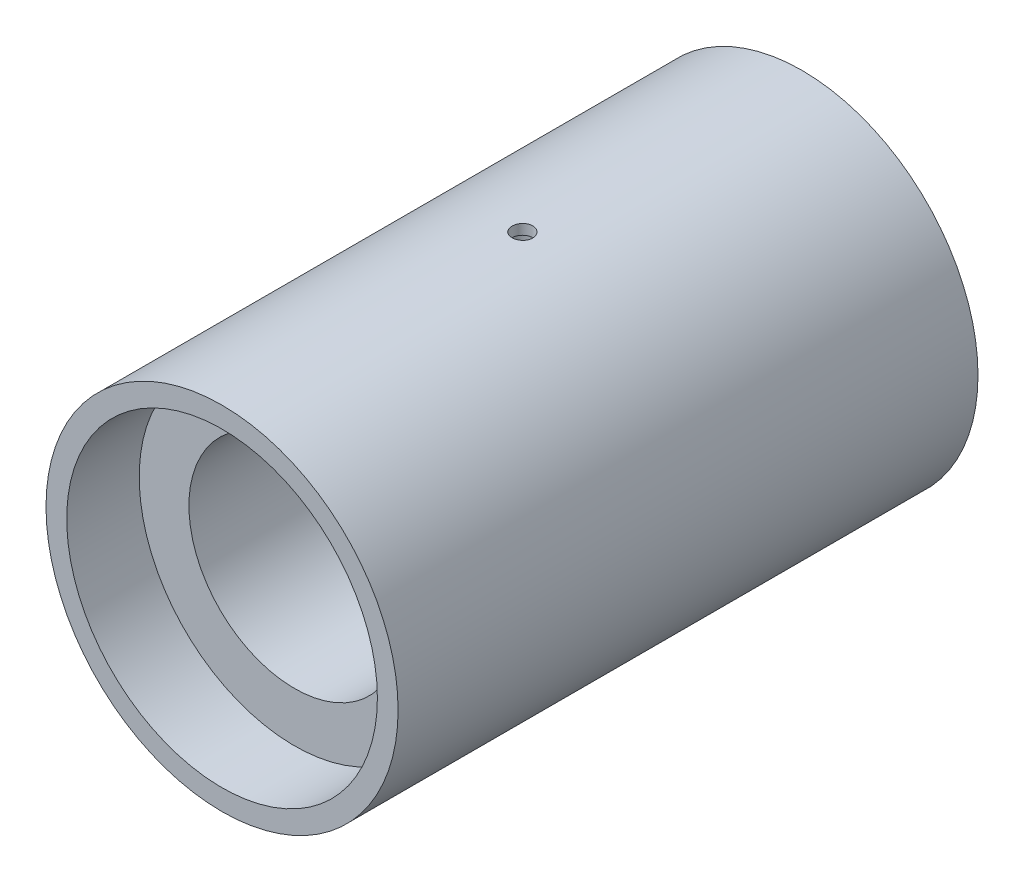
ISO-10303-21;
HEADER;
FILE_DESCRIPTION(('STEP AP214'),'2;1');
FILE_NAME('part.step','',(''),(''),'','','');
FILE_SCHEMA(('AUTOMOTIVE_DESIGN { 1 0 10303 214 1 1 1 1 }'));
ENDSEC;
DATA;
#1=APPLICATION_CONTEXT('core data for automotive mechanical design processes');
#2=APPLICATION_PROTOCOL_DEFINITION('international standard','automotive_design',2000,#1);
#3=PRODUCT_CONTEXT('',#1,'mechanical');
#4=PRODUCT('Part','Part','',(#3));
#5=PRODUCT_RELATED_PRODUCT_CATEGORY('part','',(#4));
#6=PRODUCT_DEFINITION_FORMATION('','',#4);
#7=PRODUCT_DEFINITION_CONTEXT('part definition',#1,'design');
#8=PRODUCT_DEFINITION('design','',#6,#7);
#9=PRODUCT_DEFINITION_SHAPE('','',#8);
#10=(LENGTH_UNIT() NAMED_UNIT(*) SI_UNIT(.MILLI.,.METRE.));
#11=(NAMED_UNIT(*) PLANE_ANGLE_UNIT() SI_UNIT($,.RADIAN.));
#12=(NAMED_UNIT(*) SI_UNIT($,.STERADIAN.) SOLID_ANGLE_UNIT());
#13=UNCERTAINTY_MEASURE_WITH_UNIT(LENGTH_MEASURE(1.E-05),#10,'distance_accuracy_value','');
#14=(GEOMETRIC_REPRESENTATION_CONTEXT(3) GLOBAL_UNCERTAINTY_ASSIGNED_CONTEXT((#13)) GLOBAL_UNIT_ASSIGNED_CONTEXT((#10,
#11,#12)) REPRESENTATION_CONTEXT('',''));
#15=CARTESIAN_POINT('',(0.,0.,0.));
#16=DIRECTION('',(0.,0.,1.));
#17=DIRECTION('',(1.,0.,0.));
#18=AXIS2_PLACEMENT_3D('',#15,#16,#17);
#19=CARTESIAN_POINT('',(10.2,0.,-7.));
#20=DIRECTION('',(0.,0.,-1.));
#21=DIRECTION('',(-1.,0.,0.));
#22=AXIS2_PLACEMENT_3D('',#19,#20,#21);
#23=PLANE('',#22);
#24=CARTESIAN_POINT('',(0.,0.,-7.));
#25=DIRECTION('',(0.,0.,1.));
#26=DIRECTION('',(1.,0.,0.));
#27=AXIS2_PLACEMENT_3D('',#24,#25,#26);
#28=CIRCLE('',#27,15.);
#29=CARTESIAN_POINT('',(15.,0.,-7.));
#30=VERTEX_POINT('',#29);
#31=EDGE_CURVE('E238',#30,#30,#28,.T.);
#32=ORIENTED_EDGE('',*,*,#31,.T.);
#33=EDGE_LOOP('',(#32));
#34=FACE_BOUND('',#33,.T.);
#35=CARTESIAN_POINT('',(0.,0.,-7.));
#36=DIRECTION('',(0.,0.,1.));
#37=DIRECTION('',(1.,0.,0.));
#38=AXIS2_PLACEMENT_3D('',#35,#36,#37);
#39=CIRCLE('',#38,10.2);
#40=CARTESIAN_POINT('',(10.2,0.,-7.));
#41=VERTEX_POINT('',#40);
#42=EDGE_CURVE('E11',#41,#41,#39,.F.);
#43=ORIENTED_EDGE('',*,*,#42,.T.);
#44=EDGE_LOOP('',(#43));
#45=FACE_BOUND('',#44,.T.);
#46=ADVANCED_FACE('F41',(#34,#45),#23,.F.);
#47=CARTESIAN_POINT('',(0.,0.,-55.));
#48=DIRECTION('',(0.,0.,-1.));
#49=DIRECTION('',(-1.,0.,0.));
#50=AXIS2_PLACEMENT_3D('',#47,#48,#49);
#51=PLANE('',#50);
#52=CARTESIAN_POINT('',(0.,0.,-55.));
#53=DIRECTION('',(0.,0.,-1.));
#54=DIRECTION('',(-1.,0.,0.));
#55=AXIS2_PLACEMENT_3D('',#52,#53,#54);
#56=CIRCLE('',#55,5.);
#57=CARTESIAN_POINT('',(4.78340576371954,-1.45568859980928,-55.));
#58=VERTEX_POINT('',#57);
#59=CARTESIAN_POINT('',(2.26420311297507,-4.45795740930687,-55.));
#60=VERTEX_POINT('',#59);
#61=EDGE_CURVE('E122',#58,#60,#56,.T.);
#62=ORIENTED_EDGE('',*,*,#61,.F.);
#63=CARTESIAN_POINT('',(3.83022221559489,-3.21393804843269,-55.));
#64=DIRECTION('',(0.,0.,-1.));
#65=DIRECTION('',(-1.,0.,0.));
#66=AXIS2_PLACEMENT_3D('',#63,#64,#65);
#67=CIRCLE('',#66,2.);
#68=EDGE_CURVE('E126',#58,#60,#67,.T.);
#69=ORIENTED_EDGE('',*,*,#68,.T.);
#70=EDGE_LOOP('',(#62,#69));
#71=FACE_BOUND('',#70,.T.);
#72=ADVANCED_FACE('F227',(#71),#51,.T.);
#73=CARTESIAN_POINT('',(0.,0.,-55.));
#74=DIRECTION('',(0.,0.,-1.));
#75=DIRECTION('',(-1.,0.,0.));
#76=AXIS2_PLACEMENT_3D('',#73,#74,#75);
#77=PLANE('',#76);
#78=CARTESIAN_POINT('',(0.,0.,-55.));
#79=DIRECTION('',(0.,0.,-1.));
#80=DIRECTION('',(-1.,0.,0.));
#81=AXIS2_PLACEMENT_3D('',#78,#79,#80);
#82=CIRCLE('',#81,5.);
#83=CARTESIAN_POINT('',(-1.95959179422654,4.6,-55.));
#84=VERTEX_POINT('',#83);
#85=CARTESIAN_POINT('',(1.95959179422654,4.6,-55.));
#86=VERTEX_POINT('',#85);
#87=EDGE_CURVE('E139',#84,#86,#82,.T.);
#88=ORIENTED_EDGE('',*,*,#87,.F.);
#89=CARTESIAN_POINT('',(0.,5.,-55.));
#90=DIRECTION('',(0.,0.,-1.));
#91=DIRECTION('',(-1.,0.,0.));
#92=AXIS2_PLACEMENT_3D('',#89,#90,#91);
#93=CIRCLE('',#92,2.);
#94=EDGE_CURVE('E143',#84,#86,#93,.T.);
#95=ORIENTED_EDGE('',*,*,#94,.T.);
#96=EDGE_LOOP('',(#88,#95));
#97=FACE_BOUND('',#96,.T.);
#98=ADVANCED_FACE('F232',(#97),#77,.T.);
#99=CARTESIAN_POINT('',(0.,0.,-55.));
#100=DIRECTION('',(0.,0.,-1.));
#101=DIRECTION('',(-1.,0.,0.));
#102=AXIS2_PLACEMENT_3D('',#99,#100,#101);
#103=PLANE('',#102);
#104=CARTESIAN_POINT('',(0.,0.,-55.));
#105=DIRECTION('',(0.,0.,-1.));
#106=DIRECTION('',(-1.,0.,0.));
#107=AXIS2_PLACEMENT_3D('',#104,#105,#106);
#108=CIRCLE('',#107,5.);
#109=CARTESIAN_POINT('',(-2.26420311297507,-4.45795740930687,-55.));
#110=VERTEX_POINT('',#109);
#111=CARTESIAN_POINT('',(-4.78340576371954,-1.45568859980928,-55.));
#112=VERTEX_POINT('',#111);
#113=EDGE_CURVE('E96',#110,#112,#108,.T.);
#114=ORIENTED_EDGE('',*,*,#113,.F.);
#115=CARTESIAN_POINT('',(-3.83022221559489,-3.21393804843269,-55.));
#116=DIRECTION('',(0.,0.,-1.));
#117=DIRECTION('',(-1.,0.,0.));
#118=AXIS2_PLACEMENT_3D('',#115,#116,#117);
#119=CIRCLE('',#118,2.);
#120=EDGE_CURVE('E98',#110,#112,#119,.T.);
#121=ORIENTED_EDGE('',*,*,#120,.T.);
#122=EDGE_LOOP('',(#114,#121));
#123=FACE_BOUND('',#122,.T.);
#124=ADVANCED_FACE('F97',(#123),#103,.T.);
#125=CARTESIAN_POINT('',(0.,5.,-55.));
#126=DIRECTION('',(0.,0.,-1.));
#127=DIRECTION('',(-1.,0.,0.));
#128=AXIS2_PLACEMENT_3D('',#125,#126,#127);
#129=CYLINDRICAL_SURFACE('',#128,2.);
#130=CARTESIAN_POINT('',(0.,5.,-56.));
#131=DIRECTION('',(0.,0.,-1.));
#132=DIRECTION('',(-1.,0.,0.));
#133=AXIS2_PLACEMENT_3D('',#130,#131,#132);
#134=CIRCLE('',#133,2.);
#135=CARTESIAN_POINT('',(-1.95959179422654,4.6,-56.));
#136=VERTEX_POINT('',#135);
#137=CARTESIAN_POINT('',(1.95959179422654,4.6,-56.));
#138=VERTEX_POINT('',#137);
#139=EDGE_CURVE('E144',#136,#138,#134,.T.);
#140=ORIENTED_EDGE('',*,*,#139,.T.);
#141=DIRECTION('',(0.,0.,-1.));
#142=VECTOR('',#141,1.);
#143=CARTESIAN_POINT('',(1.95959179422654,4.6,-55.));
#144=LINE('',#143,#142);
#145=EDGE_CURVE('E133',#86,#138,#144,.T.);
#146=ORIENTED_EDGE('',*,*,#145,.F.);
#147=ORIENTED_EDGE('',*,*,#94,.F.);
#148=DIRECTION('',(0.,0.,-1.));
#149=VECTOR('',#148,1.);
#150=CARTESIAN_POINT('',(-1.95959179422654,4.6,-55.));
#151=LINE('',#150,#149);
#152=EDGE_CURVE('E148',#84,#136,#151,.T.);
#153=ORIENTED_EDGE('',*,*,#152,.T.);
#154=EDGE_LOOP('',(#140,#146,#147,#153));
#155=FACE_BOUND('',#154,.T.);
#156=ADVANCED_FACE('F204',(#155),#129,.F.);
#157=CARTESIAN_POINT('',(3.83022221559489,-3.21393804843269,-55.));
#158=DIRECTION('',(0.,0.,-1.));
#159=DIRECTION('',(-1.,0.,0.));
#160=AXIS2_PLACEMENT_3D('',#157,#158,#159);
#161=CYLINDRICAL_SURFACE('',#160,2.);
#162=CARTESIAN_POINT('',(3.83022221559489,-3.21393804843269,-56.));
#163=DIRECTION('',(0.,0.,-1.));
#164=DIRECTION('',(-1.,0.,0.));
#165=AXIS2_PLACEMENT_3D('',#162,#163,#164);
#166=CIRCLE('',#165,2.);
#167=CARTESIAN_POINT('',(4.78340576371954,-1.45568859980928,-56.));
#168=VERTEX_POINT('',#167);
#169=CARTESIAN_POINT('',(2.26420311297507,-4.45795740930687,-56.));
#170=VERTEX_POINT('',#169);
#171=EDGE_CURVE('E127',#168,#170,#166,.T.);
#172=ORIENTED_EDGE('',*,*,#171,.T.);
#173=DIRECTION('',(0.,0.,-1.));
#174=VECTOR('',#173,1.);
#175=CARTESIAN_POINT('',(2.26420311297507,-4.45795740930687,-55.));
#176=LINE('',#175,#174);
#177=EDGE_CURVE('E134',#60,#170,#176,.T.);
#178=ORIENTED_EDGE('',*,*,#177,.F.);
#179=ORIENTED_EDGE('',*,*,#68,.F.);
#180=DIRECTION('',(0.,0.,-1.));
#181=VECTOR('',#180,1.);
#182=CARTESIAN_POINT('',(4.78340576371954,-1.45568859980928,-55.));
#183=LINE('',#182,#181);
#184=EDGE_CURVE('E64',#58,#168,#183,.T.);
#185=ORIENTED_EDGE('',*,*,#184,.T.);
#186=EDGE_LOOP('',(#172,#178,#179,#185));
#187=FACE_BOUND('',#186,.T.);
#188=ADVANCED_FACE('F264',(#187),#161,.F.);
#189=CARTESIAN_POINT('',(-3.83022221559489,-3.21393804843269,-55.));
#190=DIRECTION('',(0.,0.,-1.));
#191=DIRECTION('',(-1.,0.,0.));
#192=AXIS2_PLACEMENT_3D('',#189,#190,#191);
#193=CYLINDRICAL_SURFACE('',#192,2.);
#194=CARTESIAN_POINT('',(-3.83022221559489,-3.21393804843269,-56.));
#195=DIRECTION('',(0.,0.,-1.));
#196=DIRECTION('',(-1.,0.,0.));
#197=AXIS2_PLACEMENT_3D('',#194,#195,#196);
#198=CIRCLE('',#197,2.);
#199=CARTESIAN_POINT('',(-2.26420311297507,-4.45795740930687,-56.));
#200=VERTEX_POINT('',#199);
#201=CARTESIAN_POINT('',(-4.78340576371954,-1.45568859980928,-56.));
#202=VERTEX_POINT('',#201);
#203=EDGE_CURVE('E102',#200,#202,#198,.T.);
#204=ORIENTED_EDGE('',*,*,#203,.T.);
#205=DIRECTION('',(0.,0.,-1.));
#206=VECTOR('',#205,1.);
#207=CARTESIAN_POINT('',(-4.78340576371954,-1.45568859980928,-55.));
#208=LINE('',#207,#206);
#209=EDGE_CURVE('E105',#112,#202,#208,.T.);
#210=ORIENTED_EDGE('',*,*,#209,.F.);
#211=ORIENTED_EDGE('',*,*,#120,.F.);
#212=DIRECTION('',(0.,0.,-1.));
#213=VECTOR('',#212,1.);
#214=CARTESIAN_POINT('',(-2.26420311297507,-4.45795740930687,-55.));
#215=LINE('',#214,#213);
#216=EDGE_CURVE('E56',#110,#200,#215,.T.);
#217=ORIENTED_EDGE('',*,*,#216,.T.);
#218=EDGE_LOOP('',(#204,#210,#211,#217));
#219=FACE_BOUND('',#218,.T.);
#220=ADVANCED_FACE('F104',(#219),#193,.F.);
#221=CARTESIAN_POINT('',(0.,16.,0.));
#222=DIRECTION('',(0.,1.,0.));
#223=DIRECTION('',(0.,0.,1.));
#224=AXIS2_PLACEMENT_3D('',#221,#222,#223);
#225=PLANE('',#224);
#226=CARTESIAN_POINT('',(0.,16.,-29.));
#227=DIRECTION('',(0.,1.,0.));
#228=DIRECTION('',(0.,0.,1.));
#229=AXIS2_PLACEMENT_3D('',#226,#227,#228);
#230=CIRCLE('',#229,1.);
#231=CARTESIAN_POINT('',(0.,16.,-28.));
#232=VERTEX_POINT('',#231);
#233=EDGE_CURVE('E118',#232,#232,#230,.F.);
#234=ORIENTED_EDGE('',*,*,#233,.F.);
#235=EDGE_LOOP('',(#234));
#236=FACE_BOUND('',#235,.T.);
#237=CARTESIAN_POINT('',(0.,16.,-29.));
#238=DIRECTION('',(0.,1.,0.));
#239=DIRECTION('',(0.,0.,1.));
#240=AXIS2_PLACEMENT_3D('',#237,#238,#239);
#241=CIRCLE('',#240,1.5);
#242=CARTESIAN_POINT('',(0.,16.,-27.5));
#243=VERTEX_POINT('',#242);
#244=EDGE_CURVE('E178',#243,#243,#241,.T.);
#245=ORIENTED_EDGE('',*,*,#244,.F.);
#246=EDGE_LOOP('',(#245));
#247=FACE_BOUND('',#246,.T.);
#248=ADVANCED_FACE('F185',(#236,#247),#225,.F.);
#249=CARTESIAN_POINT('',(0.,0.,-54.));
#250=DIRECTION('',(0.,0.,-1.));
#251=DIRECTION('',(-1.,0.,0.));
#252=AXIS2_PLACEMENT_3D('',#249,#250,#251);
#253=CYLINDRICAL_SURFACE('',#252,5.);
#254=CARTESIAN_POINT('',(0.,0.,-54.));
#255=DIRECTION('',(0.,0.,-1.));
#256=DIRECTION('',(-1.,0.,0.));
#257=AXIS2_PLACEMENT_3D('',#254,#255,#256);
#258=CIRCLE('',#257,5.);
#259=CARTESIAN_POINT('',(-5.,0.,-54.));
#260=VERTEX_POINT('',#259);
#261=EDGE_CURVE('E161',#260,#260,#258,.T.);
#262=ORIENTED_EDGE('',*,*,#261,.F.);
#263=EDGE_LOOP('',(#262));
#264=FACE_BOUND('',#263,.T.);
#265=ORIENTED_EDGE('',*,*,#113,.T.);
#266=ORIENTED_EDGE('',*,*,#209,.T.);
#267=CARTESIAN_POINT('',(0.,0.,-56.));
#268=DIRECTION('',(0.,0.,-1.));
#269=DIRECTION('',(-1.,0.,0.));
#270=AXIS2_PLACEMENT_3D('',#267,#268,#269);
#271=CIRCLE('',#270,5.);
#272=EDGE_CURVE('E160',#202,#136,#271,.T.);
#273=ORIENTED_EDGE('',*,*,#272,.T.);
#274=ORIENTED_EDGE('',*,*,#152,.F.);
#275=ORIENTED_EDGE('',*,*,#87,.T.);
#276=ORIENTED_EDGE('',*,*,#145,.T.);
#277=EDGE_CURVE('E166',#138,#168,#271,.T.);
#278=ORIENTED_EDGE('',*,*,#277,.T.);
#279=ORIENTED_EDGE('',*,*,#184,.F.);
#280=ORIENTED_EDGE('',*,*,#61,.T.);
#281=ORIENTED_EDGE('',*,*,#177,.T.);
#282=EDGE_CURVE('E112',#170,#200,#271,.T.);
#283=ORIENTED_EDGE('',*,*,#282,.T.);
#284=ORIENTED_EDGE('',*,*,#216,.F.);
#285=EDGE_LOOP('',(#265,#266,#273,#274,#275,#276,#278,#279,#280,#281,#283,#284));
#286=FACE_BOUND('',#285,.T.);
#287=ADVANCED_FACE('F109',(#264,#286),#253,.F.);
#288=CARTESIAN_POINT('',(0.,-17.001,-29.));
#289=DIRECTION('',(0.,1.,0.));
#290=DIRECTION('',(0.,0.,1.));
#291=AXIS2_PLACEMENT_3D('',#288,#289,#290);
#292=CYLINDRICAL_SURFACE('',#291,1.5);
#293=ORIENTED_EDGE('',*,*,#244,.T.);
#294=EDGE_LOOP('',(#293));
#295=FACE_BOUND('',#294,.T.);
#296=CARTESIAN_POINT('',(0.,10.2,-27.5));
#297=CARTESIAN_POINT('',(-0.0837709583601863,10.1999986758786,-27.5000034691351));
#298=CARTESIAN_POINT('',(-0.167591000845633,10.1989571778806,-27.5070412609273));
#299=CARTESIAN_POINT('',(-0.332889518608317,10.1949026648679,-27.5350001068454));
#300=CARTESIAN_POINT('',(-0.414365610813612,10.1918877126094,-27.5559348031717));
#301=CARTESIAN_POINT('',(-0.572559998892476,10.1842252101695,-27.6110495159677));
#302=CARTESIAN_POINT('',(-0.649281791924692,10.1795788771779,-27.6452196592923));
#303=CARTESIAN_POINT('',(-0.795890421912182,10.1691674544838,-27.7258114797239));
#304=CARTESIAN_POINT('',(-0.865778234247596,10.1634025247847,-27.7722314049721));
#305=CARTESIAN_POINT('',(-0.997272719875977,10.1513468320933,-27.8763772085879));
#306=CARTESIAN_POINT('',(-1.05882055429516,10.1450527942028,-27.9341770056329));
#307=CARTESIAN_POINT('',(-1.17138042522914,10.1326739915532,-28.0592827901892));
#308=CARTESIAN_POINT('',(-1.22239186498628,10.1265892386639,-28.1265893157768));
#309=CARTESIAN_POINT('',(-1.31265878315938,10.1152861272837,-28.2691917581803));
#310=CARTESIAN_POINT('',(-1.35185755045699,10.1100720002653,-28.3445239374341));
#311=CARTESIAN_POINT('',(-1.41702403146797,10.1011450534973,-28.5007922160617));
#312=CARTESIAN_POINT('',(-1.44299243808167,10.0974321551275,-28.5817280217102));
#313=CARTESIAN_POINT('',(-1.48077878582499,10.0919601535812,-28.7462881962278));
#314=CARTESIAN_POINT('',(-1.49269730248069,10.0901871702623,-28.8298890009929));
#315=CARTESIAN_POINT('',(-1.50235707618589,10.088753567205,-28.9979213683292));
#316=CARTESIAN_POINT('',(-1.50009911609248,10.0890928308235,-29.0823528847695));
#317=CARTESIAN_POINT('',(-1.48155226962465,10.0918326946901,-29.2489407169094));
#318=CARTESIAN_POINT('',(-1.46537524248586,10.0942168607954,-29.3311097954758));
#319=CARTESIAN_POINT('',(-1.41962449962311,10.1007522280441,-29.4915544665799));
#320=CARTESIAN_POINT('',(-1.39005041841363,10.1049034773952,-29.5698299528318));
#321=CARTESIAN_POINT('',(-1.31822823548456,10.1145234853338,-29.720606731031));
#322=CARTESIAN_POINT('',(-1.27593259804287,10.1199971700072,-29.7930850522748));
#323=CARTESIAN_POINT('',(-1.17990179286499,10.1316417130199,-29.9299580245377));
#324=CARTESIAN_POINT('',(-1.12616590307109,10.1378126153529,-29.9943521649114));
#325=CARTESIAN_POINT('',(-1.00816519462506,10.150228959145,-30.1138772817733));
#326=CARTESIAN_POINT('',(-0.943804171526484,10.1564745471033,-30.1689133099459));
#327=CARTESIAN_POINT('',(-0.806708482496549,10.1682814280806,-30.2674170141494));
#328=CARTESIAN_POINT('',(-0.733973782426939,10.1738427183097,-30.3108846430151));
#329=CARTESIAN_POINT('',(-0.582114262108022,10.1836598852282,-30.3850219318779));
#330=CARTESIAN_POINT('',(-0.502985900921915,10.1879150322026,-30.415684441357));
#331=CARTESIAN_POINT('',(-0.340626566939206,10.1946343178142,-30.4632594629609));
#332=CARTESIAN_POINT('',(-0.257395861001776,10.1970985727859,-30.4801728682218));
#333=CARTESIAN_POINT('',(-0.090014111569337,10.1999430491002,-30.4996437219123));
#334=CARTESIAN_POINT('',(-0.00587856658341827,10.2003422239635,-30.5023317377166));
#335=CARTESIAN_POINT('',(0.161642049248206,10.1990631040721,-30.4936218229196));
#336=CARTESIAN_POINT('',(0.245027142324686,10.1973848710622,-30.4822243109692));
#337=CARTESIAN_POINT('',(0.408285662654919,10.1921512315399,-30.4457754367215));
#338=CARTESIAN_POINT('',(0.488173557113832,10.1886045493535,-30.4207875145345));
#339=CARTESIAN_POINT('',(0.642625811804844,10.18003047583,-30.3579339157871));
#340=CARTESIAN_POINT('',(0.717189930298869,10.1750030173081,-30.3200676549061));
#341=CARTESIAN_POINT('',(0.859453311692382,10.1639791703845,-30.232224732236));
#342=CARTESIAN_POINT('',(0.92710078873004,10.1579762369324,-30.1821650385534));
#343=CARTESIAN_POINT('',(1.05308093533319,10.1456904354599,-30.0714720972269));
#344=CARTESIAN_POINT('',(1.11141308530605,10.1394075518494,-30.0108382601701));
#345=CARTESIAN_POINT('',(1.21758033976865,10.1272100725057,-29.88013769475));
#346=CARTESIAN_POINT('',(1.26532803950941,10.1212988126785,-29.8099996096155));
#347=CARTESIAN_POINT('',(1.34836394398672,10.1105724359873,-29.6626219356024));
#348=CARTESIAN_POINT('',(1.38365247498168,10.1057572904215,-29.5853825327471));
#349=CARTESIAN_POINT('',(1.44063209201393,10.0977923148957,-29.4262581012863));
#350=CARTESIAN_POINT('',(1.4623695886066,10.0946368067609,-29.3443899881756));
#351=CARTESIAN_POINT('',(1.49177804066087,10.0903331412113,-29.1781153080943));
#352=CARTESIAN_POINT('',(1.49944992659172,10.089184851015,-29.093708909412));
#353=CARTESIAN_POINT('',(1.50048788415599,10.0890304602159,-28.9256246060609));
#354=CARTESIAN_POINT('',(1.49399136745657,10.0900037831866,-28.8419475363318));
#355=CARTESIAN_POINT('',(1.46717095679316,10.0939382921992,-28.6768896123943));
#356=CARTESIAN_POINT('',(1.44684708161104,10.0968994755409,-28.5955087550673));
#357=CARTESIAN_POINT('',(1.39299677176856,10.1044689656498,-28.437388928267));
#358=CARTESIAN_POINT('',(1.3594795681722,10.1090761205614,-28.3606467564284));
#359=CARTESIAN_POINT('',(1.28020766093815,10.1194199021726,-28.2138528638727));
#360=CARTESIAN_POINT('',(1.23445257547442,10.1251565641118,-28.143801351999));
#361=CARTESIAN_POINT('',(1.1315030878845,10.1371792807035,-28.0116785493301));
#362=CARTESIAN_POINT('',(1.07420681665598,10.1434699251543,-27.9496870433924));
#363=CARTESIAN_POINT('',(0.950016572136279,10.155853208106,-27.8361495316763));
#364=CARTESIAN_POINT('',(0.883120367697712,10.1619458001721,-27.7846059608689));
#365=CARTESIAN_POINT('',(0.741214643286736,10.1732831355418,-27.6931854849219));
#366=CARTESIAN_POINT('',(0.666164150967164,10.1785232324753,-27.6533716150812));
#367=CARTESIAN_POINT('',(0.510400550586076,10.1875194748481,-27.586973419809));
#368=CARTESIAN_POINT('',(0.429693444770876,10.1912771660173,-27.56037530653));
#369=CARTESIAN_POINT('',(0.290514130912605,10.1960213077036,-27.5272402823611));
#370=CARTESIAN_POINT('',(0.232903574537191,10.1975057051415,-27.5170406679468));
#371=CARTESIAN_POINT('',(0.116869970217046,10.1994955074757,-27.5034193562529));
#372=CARTESIAN_POINT('',(0.0584469317966774,10.2000009238385,-27.4999975795871));
#373=CARTESIAN_POINT('',(0.,10.2,-27.5));
#374=B_SPLINE_CURVE_WITH_KNOTS('',3,(#296,#297,#298,#299,#300,#301,#302,#303,#304,#305,#306,
#307,#308,#309,#310,#311,#312,#313,#314,#315,#316,#317,#318,#319,#320,#321,#322,#323,#324,#325,
#326,#327,#328,#329,#330,#331,#332,#333,#334,#335,#336,#337,#338,#339,#340,#341,#342,#343,#344,
#345,#346,#347,#348,#349,#350,#351,#352,#353,#354,#355,#356,#357,#358,#359,#360,#361,#362,#363,
#364,#365,#366,#367,#368,#369,#370,#371,#372,#373),.UNSPECIFIED.,.T.,.F.,(4,2,2,2,2,2,2,2,2,2,2,
2,2,2,2,2,2,2,2,2,2,2,2,2,2,2,2,2,2,2,2,2,2,2,2,2,2,2,4),(0.,0.251099314507142,
0.502445491398109,0.753604533478106,1.00472767639288,1.25753928185151,1.51036520206629,
1.76438624822404,2.01839398942596,2.27057216730676,2.52273641946127,2.77289290648458,
3.02305621844701,3.27416616223807,3.52529195967056,3.77883065454945,4.03237038310512,
4.28605150230393,4.53971614116725,4.79104843578275,5.04237326046619,5.2925348447314,
5.54270778093383,5.79463440208972,6.04657507036712,6.30052454327215,6.55446736570953,
6.80753561825085,7.06058712919963,7.31119535281461,7.56180323602628,7.81223608553947,
8.06267674955349,8.31543328854717,8.56824866682176,8.82239887617116,9.07628337383077,
9.25147722016712,9.42666901451296),.UNSPECIFIED.);
#375=CARTESIAN_POINT('',(0.,10.2,-27.5));
#376=VERTEX_POINT('',#375);
#377=EDGE_CURVE('E165',#376,#376,#374,.T.);
#378=ORIENTED_EDGE('',*,*,#377,.T.);
#379=EDGE_LOOP('',(#378));
#380=FACE_BOUND('',#379,.T.);
#381=ADVANCED_FACE('F180',(#295,#380),#292,.F.);
#382=CARTESIAN_POINT('',(0.,0.,-54.));
#383=DIRECTION('',(0.,0.,-1.));
#384=DIRECTION('',(-1.,0.,0.));
#385=AXIS2_PLACEMENT_3D('',#382,#383,#384);
#386=PLANE('',#385);
#387=ORIENTED_EDGE('',*,*,#261,.T.);
#388=EDGE_LOOP('',(#387));
#389=FACE_BOUND('',#388,.T.);
#390=CARTESIAN_POINT('',(0.,0.,-54.));
#391=DIRECTION('',(0.,0.,-1.));
#392=DIRECTION('',(-1.,0.,0.));
#393=AXIS2_PLACEMENT_3D('',#390,#391,#392);
#394=CIRCLE('',#393,10.2);
#395=CARTESIAN_POINT('',(-10.2,0.,-54.));
#396=VERTEX_POINT('',#395);
#397=EDGE_CURVE('E212',#396,#396,#394,.F.);
#398=ORIENTED_EDGE('',*,*,#397,.T.);
#399=EDGE_LOOP('',(#398));
#400=FACE_BOUND('',#399,.T.);
#401=ADVANCED_FACE('F192',(#389,#400),#386,.F.);
#402=CARTESIAN_POINT('',(0.,0.,-56.));
#403=DIRECTION('',(0.,0.,1.));
#404=DIRECTION('',(1.,0.,0.));
#405=AXIS2_PLACEMENT_3D('',#402,#403,#404);
#406=CYLINDRICAL_SURFACE('',#405,10.2);
#407=ORIENTED_EDGE('',*,*,#397,.F.);
#408=EDGE_LOOP('',(#407));
#409=FACE_BOUND('',#408,.T.);
#410=ORIENTED_EDGE('',*,*,#377,.F.);
#411=EDGE_LOOP('',(#410));
#412=FACE_BOUND('',#411,.T.);
#413=ORIENTED_EDGE('',*,*,#42,.F.);
#414=EDGE_LOOP('',(#413));
#415=FACE_BOUND('',#414,.T.);
#416=ADVANCED_FACE('F195',(#409,#412,#415),#406,.F.);
#417=CARTESIAN_POINT('',(0.,0.,-56.));
#418=DIRECTION('',(0.,0.,1.));
#419=DIRECTION('',(1.,0.,0.));
#420=AXIS2_PLACEMENT_3D('',#417,#418,#419);
#421=PLANE('',#420);
#422=CARTESIAN_POINT('',(0.,0.,-56.));
#423=DIRECTION('',(0.,0.,1.));
#424=DIRECTION('',(1.,0.,0.));
#425=AXIS2_PLACEMENT_3D('',#422,#423,#424);
#426=CIRCLE('',#425,17.);
#427=CARTESIAN_POINT('',(17.,0.,-56.));
#428=VERTEX_POINT('',#427);
#429=EDGE_CURVE('E440',#428,#428,#426,.T.);
#430=ORIENTED_EDGE('',*,*,#429,.F.);
#431=EDGE_LOOP('',(#430));
#432=FACE_BOUND('',#431,.T.);
#433=ORIENTED_EDGE('',*,*,#272,.F.);
#434=ORIENTED_EDGE('',*,*,#203,.F.);
#435=ORIENTED_EDGE('',*,*,#282,.F.);
#436=ORIENTED_EDGE('',*,*,#171,.F.);
#437=ORIENTED_EDGE('',*,*,#277,.F.);
#438=ORIENTED_EDGE('',*,*,#139,.F.);
#439=EDGE_LOOP('',(#433,#434,#435,#436,#437,#438));
#440=FACE_BOUND('',#439,.T.);
#441=ADVANCED_FACE('F202',(#432,#440),#421,.F.);
#442=CARTESIAN_POINT('',(0.,13.1715728752538,-29.));
#443=DIRECTION('',(0.,1.,0.));
#444=DIRECTION('',(0.,0.,1.));
#445=AXIS2_PLACEMENT_3D('',#442,#443,#444);
#446=CYLINDRICAL_SURFACE('',#445,1.);
#447=CARTESIAN_POINT('',(0.,17.,-28.));
#448=CARTESIAN_POINT('',(0.0561183746501264,16.9999996082067,-28.0000024716357));
#449=CARTESIAN_POINT('',(0.112276202860598,16.9997191499508,-28.0047397791588));
#450=CARTESIAN_POINT('',(0.223041674009741,16.9986273089947,-28.023570099752));
#451=CARTESIAN_POINT('',(0.277647427794243,16.99781530595,-28.0376740445267));
#452=CARTESIAN_POINT('',(0.38368824240781,16.995752249275,-28.0748315492316));
#453=CARTESIAN_POINT('',(0.435124941635176,16.9945014247927,-28.0978804388714));
#454=CARTESIAN_POINT('',(0.533385723026011,16.9917014683063,-28.1522661123082));
#455=CARTESIAN_POINT('',(0.580210868421177,16.9901524053082,-28.1836009795363));
#456=CARTESIAN_POINT('',(0.667995846390313,16.9869278107431,-28.253715430904));
#457=CARTESIAN_POINT('',(0.708948680843567,16.9852521318566,-28.2925037707974));
#458=CARTESIAN_POINT('',(0.7837667438938,16.981964425654,-28.3764062019085));
#459=CARTESIAN_POINT('',(0.81763167845635,16.9803524009807,-28.4215205554249));
#460=CARTESIAN_POINT('',(0.87733364496531,16.9773726782667,-28.516833291706));
#461=CARTESIAN_POINT('',(0.90316494942709,16.9760051548342,-28.5670352679796));
#462=CARTESIAN_POINT('',(0.946029728558036,16.9736705291336,-28.6710729792676));
#463=CARTESIAN_POINT('',(0.963063288989445,16.9727034229622,-28.7249086788539));
#464=CARTESIAN_POINT('',(0.987829865943245,16.9712800777172,-28.8346189583736));
#465=CARTESIAN_POINT('',(0.995573725716119,16.9708232430806,-28.8904910826436));
#466=CARTESIAN_POINT('',(1.00157454952996,16.9704701732292,-29.0027439105296));
#467=CARTESIAN_POINT('',(0.999831610675698,16.9705739322763,-29.0591246089339));
#468=CARTESIAN_POINT('',(0.986917320304146,16.9713297958248,-29.1707203170552));
#469=CARTESIAN_POINT('',(0.975757696579302,16.9719812182477,-29.2259366892192));
#470=CARTESIAN_POINT('',(0.94434500290671,16.9737579197931,-29.3337110780658));
#471=CARTESIAN_POINT('',(0.924091883555518,16.9748832014898,-29.3862690803043));
#472=CARTESIAN_POINT('',(0.875053770991126,16.9774815896434,-29.4872725128612));
#473=CARTESIAN_POINT('',(0.846263449215765,16.9789549132162,-29.5357153503011));
#474=CARTESIAN_POINT('',(0.78097205059819,16.9820831249695,-29.6270849885991));
#475=CARTESIAN_POINT('',(0.744470897297473,16.9837380149503,-29.6700117347543));
#476=CARTESIAN_POINT('',(0.664727875730669,16.9870458854863,-29.7491988998026));
#477=CARTESIAN_POINT('',(0.621475855871977,16.9886988593262,-29.7854490969132));
#478=CARTESIAN_POINT('',(0.529494483315231,16.9918141927135,-29.8501753337895));
#479=CARTESIAN_POINT('',(0.480765128899694,16.9932765522012,-29.8786513711176));
#480=CARTESIAN_POINT('',(0.379206204412818,16.9958459622978,-29.9270200568789));
#481=CARTESIAN_POINT('',(0.326376454135523,16.9969529972799,-29.9469123278169));
#482=CARTESIAN_POINT('',(0.218119112458328,16.9986867904689,-29.9775420306861));
#483=CARTESIAN_POINT('',(0.162691547948043,16.999313553646,-29.9882795573548));
#484=CARTESIAN_POINT('',(0.050900666474477,17.0000155334865,-30.0002823282654));
#485=CARTESIAN_POINT('',(-0.005461127958274,17.0000915731607,-30.0015617069878));
#486=CARTESIAN_POINT('',(-0.1175985454968,16.9996857248861,-29.9946487821063));
#487=CARTESIAN_POINT('',(-0.173374171298664,16.9992038395046,-29.9864565220866));
#488=CARTESIAN_POINT('',(-0.282716235495461,16.9977369278617,-29.9608445697599));
#489=CARTESIAN_POINT('',(-0.336284195719763,16.9967522546801,-29.9434313524977));
#490=CARTESIAN_POINT('',(-0.439737273498814,16.9943905722397,-29.8998783554226));
#491=CARTESIAN_POINT('',(-0.489622361686738,16.9930135598529,-29.8737385060336));
#492=CARTESIAN_POINT('',(-0.584358423026641,16.9900199316599,-29.8134382121784));
#493=CARTESIAN_POINT('',(-0.629203371432839,16.9884030343495,-29.7792683165885));
#494=CARTESIAN_POINT('',(-0.712525543101089,16.9851125847618,-29.7038916612643));
#495=CARTESIAN_POINT('',(-0.751002710614035,16.9834390319887,-29.662684839929));
#496=CARTESIAN_POINT('',(-0.820544882253057,16.9802215212302,-29.574343117712));
#497=CARTESIAN_POINT('',(-0.851600724421362,16.978677724943,-29.5272009978921));
#498=CARTESIAN_POINT('',(-0.905356030704418,16.9758963846561,-29.4283632127282));
#499=CARTESIAN_POINT('',(-0.928055541566714,16.9746588389431,-29.3766675728599));
#500=CARTESIAN_POINT('',(-0.964437928879209,16.9726307209231,-29.270223813434));
#501=CARTESIAN_POINT('',(-0.97812659534078,16.9718398616394,-29.2154776785844));
#502=CARTESIAN_POINT('',(-0.996117641244239,16.9707935026047,-29.1044593375797));
#503=CARTESIAN_POINT('',(-1.00042010116884,16.9705379982633,-29.0481871445141));
#504=CARTESIAN_POINT('',(-0.999515838122645,16.9705912734493,-28.935805174045));
#505=CARTESIAN_POINT('',(-0.994323521596244,16.9708991980853,-28.8796952797475));
#506=CARTESIAN_POINT('',(-0.974606937601246,16.9720428201189,-28.7691454304075));
#507=CARTESIAN_POINT('',(-0.96008265292127,16.9728785184899,-28.7147054784451));
#508=CARTESIAN_POINT('',(-0.922117583314701,16.9749833032909,-28.6090384526631));
#509=CARTESIAN_POINT('',(-0.898676815664675,16.9762523888812,-28.5578113726184));
#510=CARTESIAN_POINT('',(-0.843546281111595,16.9790808989316,-28.4600182342922));
#511=CARTESIAN_POINT('',(-0.811856740354144,16.9806403154317,-28.4134520482776));
#512=CARTESIAN_POINT('',(-0.741075329876088,16.9838764922282,-28.3262297411644));
#513=CARTESIAN_POINT('',(-0.701973132288073,16.9855534141621,-28.2855820074944));
#514=CARTESIAN_POINT('',(-0.617488612819354,16.9888343021954,-28.2114140992484));
#515=CARTESIAN_POINT('',(-0.572104754109951,16.9904382503136,-28.1778956739867));
#516=CARTESIAN_POINT('',(-0.476298644798581,16.9933939396066,-28.1189160450468));
#517=CARTESIAN_POINT('',(-0.425870669756793,16.9947453891248,-28.0934641355258));
#518=CARTESIAN_POINT('',(-0.321486229260541,16.9970397610062,-28.0514192433704));
#519=CARTESIAN_POINT('',(-0.267533991546778,16.9979831628725,-28.0348158573422));
#520=CARTESIAN_POINT('',(-0.177708363856153,16.9991071850645,-28.0152672896781));
#521=CARTESIAN_POINT('',(-0.142415986844461,16.9994405079764,-28.0095494294173));
#522=CARTESIAN_POINT('',(-0.0714210672826123,16.9998870399963,-28.0019150002994));
#523=CARTESIAN_POINT('',(-0.0357185252291029,17.0000002493707,-27.99999842684));
#524=CARTESIAN_POINT('',(0.,17.,-28.));
#525=B_SPLINE_CURVE_WITH_KNOTS('',3,(#447,#448,#449,#450,#451,#452,#453,#454,#455,#456,#457,
#458,#459,#460,#461,#462,#463,#464,#465,#466,#467,#468,#469,#470,#471,#472,#473,#474,#475,#476,
#477,#478,#479,#480,#481,#482,#483,#484,#485,#486,#487,#488,#489,#490,#491,#492,#493,#494,#495,
#496,#497,#498,#499,#500,#501,#502,#503,#504,#505,#506,#507,#508,#509,#510,#511,#512,#513,#514,
#515,#516,#517,#518,#519,#520,#521,#522,#523,#524),.UNSPECIFIED.,.T.,.F.,(4,2,2,2,2,2,2,2,2,2,2,
2,2,2,2,2,2,2,2,2,2,2,2,2,2,2,2,2,2,2,2,2,2,2,2,2,2,2,4),(0.,0.168224732642648,
0.336646144457545,0.504979738968159,0.673274431475586,0.841768045505397,1.01026864793928,
1.17888910701349,1.34750792230927,1.51592972796072,1.68434980968695,1.85256044557549,
2.02077199533541,2.18908875744697,2.35740718861998,2.52598121089487,2.69455528602827,
2.86313677392696,3.03171651724715,3.20004427997714,3.36837126814283,3.5365802119171,
3.7047904968266,3.87319976059687,4.04161049869066,4.21022808551262,4.37884472902851,
4.54735292013826,4.71585966635655,4.88411094904949,5.05236254205688,5.22061380906182,
5.38886046383207,5.55734327857491,5.72586738628295,5.89458496572892,6.06310374031495,
6.17017645347565,6.27724903700141),.UNSPECIFIED.);
#526=CARTESIAN_POINT('',(0.,17.,-28.));
#527=VERTEX_POINT('',#526);
#528=EDGE_CURVE('E49',#527,#527,#525,.T.);
#529=ORIENTED_EDGE('',*,*,#528,.T.);
#530=EDGE_LOOP('',(#529));
#531=FACE_BOUND('',#530,.T.);
#532=ORIENTED_EDGE('',*,*,#233,.T.);
#533=EDGE_LOOP('',(#532));
#534=FACE_BOUND('',#533,.T.);
#535=ADVANCED_FACE('F197',(#531,#534),#446,.F.);
#536=CARTESIAN_POINT('',(0.,0.,-2.));
#537=DIRECTION('',(0.,0.,1.));
#538=DIRECTION('',(1.,0.,0.));
#539=AXIS2_PLACEMENT_3D('',#536,#537,#538);
#540=CYLINDRICAL_SURFACE('',#539,17.);
#541=ORIENTED_EDGE('',*,*,#528,.F.);
#542=EDGE_LOOP('',(#541));
#543=FACE_BOUND('',#542,.T.);
#544=ORIENTED_EDGE('',*,*,#429,.T.);
#545=EDGE_LOOP('',(#544));
#546=FACE_BOUND('',#545,.T.);
#547=CARTESIAN_POINT('',(0.,0.,0.));
#548=DIRECTION('',(0.,0.,1.));
#549=DIRECTION('',(1.,0.,0.));
#550=AXIS2_PLACEMENT_3D('',#547,#548,#549);
#551=CIRCLE('',#550,17.);
#552=CARTESIAN_POINT('',(17.,0.,0.));
#553=VERTEX_POINT('',#552);
#554=EDGE_CURVE('E151',#553,#553,#551,.T.);
#555=ORIENTED_EDGE('',*,*,#554,.F.);
#556=EDGE_LOOP('',(#555));
#557=FACE_BOUND('',#556,.T.);
#558=ADVANCED_FACE('F201',(#543,#546,#557),#540,.T.);
#559=CARTESIAN_POINT('',(0.,0.,0.));
#560=DIRECTION('',(0.,0.,-1.));
#561=DIRECTION('',(-1.,0.,0.));
#562=AXIS2_PLACEMENT_3D('',#559,#560,#561);
#563=CYLINDRICAL_SURFACE('',#562,15.);
#564=CARTESIAN_POINT('',(0.,0.,0.));
#565=DIRECTION('',(0.,0.,1.));
#566=DIRECTION('',(1.,0.,0.));
#567=AXIS2_PLACEMENT_3D('',#564,#565,#566);
#568=CIRCLE('',#567,15.);
#569=CARTESIAN_POINT('',(15.,0.,0.));
#570=VERTEX_POINT('',#569);
#571=EDGE_CURVE('E242',#570,#570,#568,.T.);
#572=ORIENTED_EDGE('',*,*,#571,.T.);
#573=EDGE_LOOP('',(#572));
#574=FACE_BOUND('',#573,.T.);
#575=ORIENTED_EDGE('',*,*,#31,.F.);
#576=EDGE_LOOP('',(#575));
#577=FACE_BOUND('',#576,.T.);
#578=ADVANCED_FACE('F216',(#574,#577),#563,.F.);
#579=CARTESIAN_POINT('',(0.,0.,0.));
#580=DIRECTION('',(0.,0.,1.));
#581=DIRECTION('',(1.,0.,0.));
#582=AXIS2_PLACEMENT_3D('',#579,#580,#581);
#583=PLANE('',#582);
#584=ORIENTED_EDGE('',*,*,#571,.F.);
#585=EDGE_LOOP('',(#584));
#586=FACE_BOUND('',#585,.T.);
#587=ORIENTED_EDGE('',*,*,#554,.T.);
#588=EDGE_LOOP('',(#587));
#589=FACE_BOUND('',#588,.T.);
#590=ADVANCED_FACE('F271',(#586,#589),#583,.T.);
#591=CLOSED_SHELL('',(#46,#72,#98,#124,#156,#188,#220,#248,#287,#381,#401,#416,#441,#535,#558,
#578,#590));
#592=MANIFOLD_SOLID_BREP('B2',#591);
#593=ADVANCED_BREP_SHAPE_REPRESENTATION('',(#18,#592),#14);
#594=SHAPE_DEFINITION_REPRESENTATION(#9,#593);
ENDSEC;
END-ISO-10303-21;
